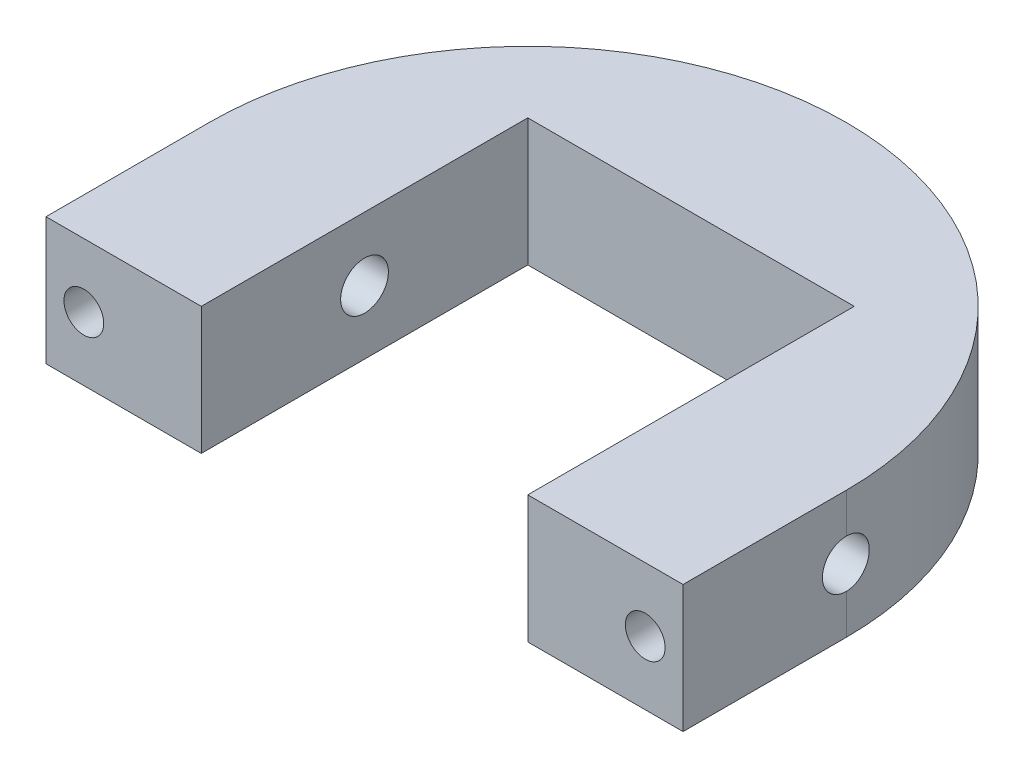
ISO-10303-21;
HEADER;
FILE_DESCRIPTION(('STEP AP214'),'2;1');
FILE_NAME('part.step','',(''),(''),'','','');
FILE_SCHEMA(('AUTOMOTIVE_DESIGN { 1 0 10303 214 1 1 1 1 }'));
ENDSEC;
DATA;
#1=APPLICATION_CONTEXT('core data for automotive mechanical design processes');
#2=APPLICATION_PROTOCOL_DEFINITION('international standard','automotive_design',2000,#1);
#3=PRODUCT_CONTEXT('',#1,'mechanical');
#4=PRODUCT('Part','Part','',(#3));
#5=PRODUCT_RELATED_PRODUCT_CATEGORY('part','',(#4));
#6=PRODUCT_DEFINITION_FORMATION('','',#4);
#7=PRODUCT_DEFINITION_CONTEXT('part definition',#1,'design');
#8=PRODUCT_DEFINITION('design','',#6,#7);
#9=PRODUCT_DEFINITION_SHAPE('','',#8);
#10=(LENGTH_UNIT() NAMED_UNIT(*) SI_UNIT(.MILLI.,.METRE.));
#11=(NAMED_UNIT(*) PLANE_ANGLE_UNIT() SI_UNIT($,.RADIAN.));
#12=(NAMED_UNIT(*) SI_UNIT($,.STERADIAN.) SOLID_ANGLE_UNIT());
#13=UNCERTAINTY_MEASURE_WITH_UNIT(LENGTH_MEASURE(1.E-05),#10,'distance_accuracy_value','');
#14=(GEOMETRIC_REPRESENTATION_CONTEXT(3) GLOBAL_UNCERTAINTY_ASSIGNED_CONTEXT((#13)) GLOBAL_UNIT_ASSIGNED_CONTEXT((#10,
#11,#12)) REPRESENTATION_CONTEXT('',''));
#15=CARTESIAN_POINT('',(0.,0.,0.));
#16=DIRECTION('',(0.,0.,1.));
#17=DIRECTION('',(1.,0.,0.));
#18=AXIS2_PLACEMENT_3D('',#15,#16,#17);
#19=CARTESIAN_POINT('',(35.25,8.,7.87476235655557));
#20=DIRECTION('',(0.,0.,1.));
#21=DIRECTION('',(1.,0.,0.));
#22=AXIS2_PLACEMENT_3D('',#19,#20,#21);
#23=CONICAL_SURFACE('',#22,2.49999999999999,1.02974425867665);
#24=CARTESIAN_POINT('',(35.25,8.,6.37261080898667));
#25=VERTEX_POINT('',#24);
#26=VERTEX_LOOP('',#25);
#27=FACE_BOUND('',#26,.T.);
#28=CARTESIAN_POINT('',(35.25,8.,7.87476235655557));
#29=DIRECTION('',(0.,0.,1.));
#30=DIRECTION('',(1.,0.,0.));
#31=AXIS2_PLACEMENT_3D('',#28,#29,#30);
#32=CIRCLE('',#31,2.49999999999999);
#33=CARTESIAN_POINT('',(37.75,8.,7.87476235655557));
#34=VERTEX_POINT('',#33);
#35=EDGE_CURVE('E213',#34,#34,#32,.T.);
#36=ORIENTED_EDGE('',*,*,#35,.T.);
#37=EDGE_LOOP('',(#36));
#38=FACE_BOUND('',#37,.T.);
#39=ADVANCED_FACE('F35',(#27,#38),#23,.F.);
#40=CARTESIAN_POINT('',(35.25,8.,32.8747623565556));
#41=DIRECTION('',(0.,0.,1.));
#42=DIRECTION('',(1.,0.,0.));
#43=AXIS2_PLACEMENT_3D('',#40,#41,#42);
#44=CYLINDRICAL_SURFACE('',#43,2.49999999999999);
#45=CARTESIAN_POINT('',(35.25,8.,20.5));
#46=DIRECTION('',(0.,0.,-1.));
#47=DIRECTION('',(-1.,0.,0.));
#48=AXIS2_PLACEMENT_3D('',#45,#46,#47);
#49=CIRCLE('',#48,2.49999999999999);
#50=CARTESIAN_POINT('',(32.75,8.,20.5));
#51=VERTEX_POINT('',#50);
#52=EDGE_CURVE('E205',#51,#51,#49,.F.);
#53=ORIENTED_EDGE('',*,*,#52,.T.);
#54=EDGE_LOOP('',(#53));
#55=FACE_BOUND('',#54,.T.);
#56=ORIENTED_EDGE('',*,*,#35,.F.);
#57=EDGE_LOOP('',(#56));
#58=FACE_BOUND('',#57,.T.);
#59=ADVANCED_FACE('F260',(#55,#58),#44,.F.);
#60=CARTESIAN_POINT('',(40.,-15.,20.5));
#61=DIRECTION('',(0.,0.,-1.));
#62=DIRECTION('',(-1.,0.,0.));
#63=AXIS2_PLACEMENT_3D('',#60,#61,#62);
#64=PLANE('',#63);
#65=DIRECTION('',(-1.,0.,0.));
#66=VECTOR('',#65,1.);
#67=CARTESIAN_POINT('',(0.,16.,20.5));
#68=LINE('',#67,#66);
#69=CARTESIAN_POINT('',(40.,16.,20.5));
#70=VERTEX_POINT('',#69);
#71=CARTESIAN_POINT('',(20.5,16.,20.5));
#72=VERTEX_POINT('',#71);
#73=EDGE_CURVE('E208',#70,#72,#68,.T.);
#74=ORIENTED_EDGE('',*,*,#73,.T.);
#75=DIRECTION('',(0.,1.,0.));
#76=VECTOR('',#75,1.);
#77=CARTESIAN_POINT('',(20.5,0.,20.5));
#78=LINE('',#77,#76);
#79=CARTESIAN_POINT('',(20.5,0.,20.5));
#80=VERTEX_POINT('',#79);
#81=EDGE_CURVE('E178',#80,#72,#78,.T.);
#82=ORIENTED_EDGE('',*,*,#81,.F.);
#83=DIRECTION('',(-1.,0.,0.));
#84=VECTOR('',#83,1.);
#85=CARTESIAN_POINT('',(0.,0.,20.5));
#86=LINE('',#85,#84);
#87=CARTESIAN_POINT('',(40.,0.,20.5));
#88=VERTEX_POINT('',#87);
#89=EDGE_CURVE('E60',#88,#80,#86,.T.);
#90=ORIENTED_EDGE('',*,*,#89,.F.);
#91=DIRECTION('',(0.,1.,0.));
#92=VECTOR('',#91,1.);
#93=CARTESIAN_POINT('',(40.,-15.,20.5));
#94=LINE('',#93,#92);
#95=EDGE_CURVE('E136',#88,#70,#94,.T.);
#96=ORIENTED_EDGE('',*,*,#95,.T.);
#97=EDGE_LOOP('',(#74,#82,#90,#96));
#98=FACE_BOUND('',#97,.T.);
#99=ORIENTED_EDGE('',*,*,#52,.F.);
#100=EDGE_LOOP('',(#99));
#101=FACE_BOUND('',#100,.T.);
#102=ADVANCED_FACE('F265',(#98,#101),#64,.F.);
#103=CARTESIAN_POINT('',(0.,16.,0.));
#104=DIRECTION('',(0.,-1.,0.));
#105=DIRECTION('',(0.,0.,-1.));
#106=AXIS2_PLACEMENT_3D('',#103,#104,#105);
#107=CYLINDRICAL_SURFACE('',#106,40.);
#108=DIRECTION('',(0.,1.,0.));
#109=VECTOR('',#108,1.);
#110=CARTESIAN_POINT('',(40.,-86.4913290451708,0.));
#111=LINE('',#110,#109);
#112=CARTESIAN_POINT('',(40.,11.,0.));
#113=VERTEX_POINT('',#112);
#114=CARTESIAN_POINT('',(40.,16.,0.));
#115=VERTEX_POINT('',#114);
#116=EDGE_CURVE('E147',#113,#115,#111,.T.);
#117=ORIENTED_EDGE('',*,*,#116,.F.);
#118=CARTESIAN_POINT('',(40.,11.,0.));
#119=CARTESIAN_POINT('',(40.0000025820989,11.0000082207304,-0.0842519337893709));
#120=CARTESIAN_POINT('',(39.999733864583,10.9964508449652,-0.168499874747025));
#121=CARTESIAN_POINT('',(39.998672903971,10.9822685414989,-0.336390706842955));
#122=CARTESIAN_POINT('',(39.997880691341,10.9716440250893,-0.420033632905374));
#123=CARTESIAN_POINT('',(39.9957926639505,10.9434026174123,-0.586059415483907));
#124=CARTESIAN_POINT('',(39.9944972614647,10.9257914502121,-0.668443246319993));
#125=CARTESIAN_POINT('',(39.9914417526773,10.883721435905,-0.831410088455883));
#126=CARTESIAN_POINT('',(39.989681651006,10.8592626570271,-0.911993117690044));
#127=CARTESIAN_POINT('',(39.9837722599733,10.7758194983056,-1.15025422156428));
#128=CARTESIAN_POINT('',(39.9789928262019,10.7067548303599,-1.30452302918149));
#129=CARTESIAN_POINT('',(39.9682934094469,10.543823834422,-1.59916835807549));
#130=CARTESIAN_POINT('',(39.9623736020872,10.4499613246073,-1.73954701347929));
#131=CARTESIAN_POINT('',(39.9500441386983,10.2398690677085,-2.00284405574504));
#132=CARTESIAN_POINT('',(39.9436336368214,10.1236001486432,-2.12573119915839));
#133=CARTESIAN_POINT('',(39.9310518285172,9.87206977950343,-2.35027392014215));
#134=CARTESIAN_POINT('',(39.9248805586831,9.73680543839624,-2.45192625998527));
#135=CARTESIAN_POINT('',(39.9134669087638,9.45094083231814,-2.63120995149278));
#136=CARTESIAN_POINT('',(39.9082256045901,9.30032311746122,-2.70881355675637));
#137=CARTESIAN_POINT('',(39.899274995184,8.98815933550294,-2.83761304626001));
#138=CARTESIAN_POINT('',(39.8955655740768,8.82661409605658,-2.88881092795233));
#139=CARTESIAN_POINT('',(39.8901052119818,8.49749425797311,-2.96326025824898));
#140=CARTESIAN_POINT('',(39.8883506039989,8.3299315592269,-2.98656403897343));
#141=CARTESIAN_POINT('',(39.8869867691731,7.99326026353682,-3.00472522509086));
#142=CARTESIAN_POINT('',(39.8873775617787,7.82415165259275,-2.99958237260813));
#143=CARTESIAN_POINT('',(39.8902571307251,7.48955598448005,-2.96103864431119));
#144=CARTESIAN_POINT('',(39.8927416305838,7.32406225012986,-2.92769536850408));
#145=CARTESIAN_POINT('',(39.8995219238671,7.0010278694021,-2.83378680992146));
#146=CARTESIAN_POINT('',(39.9038177235755,6.84348725061724,-2.77322143270828));
#147=CARTESIAN_POINT('',(39.9137415865039,6.54064304702218,-2.62652168452174));
#148=CARTESIAN_POINT('',(39.9193710288684,6.39535234238136,-2.54036082120467));
#149=CARTESIAN_POINT('',(39.9313261861455,6.12128065448371,-2.34493899779349));
#150=CARTESIAN_POINT('',(39.9376518800897,5.99249917428258,-2.23567873327706));
#151=CARTESIAN_POINT('',(39.9503050899847,5.75477592452502,-1.99685373321994));
#152=CARTESIAN_POINT('',(39.9566325755469,5.64588129615201,-1.86724207273072));
#153=CARTESIAN_POINT('',(39.9685642796887,5.45135495576657,-1.59150157606447));
#154=CARTESIAN_POINT('',(39.9741682737937,5.36573045461256,-1.44536763984626));
#155=CARTESIAN_POINT('',(39.9840229652691,5.22018178713578,-1.14068220271077));
#156=CARTESIAN_POINT('',(39.9882727401827,5.16027512949421,-0.982122328800783));
#157=CARTESIAN_POINT('',(39.9949278185792,5.06803781366773,-0.657276566091565));
#158=CARTESIAN_POINT('',(39.9973359223906,5.03566528039795,-0.491002816529944));
#159=CARTESIAN_POINT('',(39.9991276565228,5.01165189029522,-0.269659065148874));
#160=CARTESIAN_POINT('',(39.9994546007981,5.00728019678316,-0.215772816987304));
#161=CARTESIAN_POINT('',(39.9998904927226,5.00145821857928,-0.107931774306964));
#162=CARTESIAN_POINT('',(39.9999998025047,5.00000308085858,-0.053977243388215));
#163=CARTESIAN_POINT('',(40.,5.,0.));
#164=B_SPLINE_CURVE_WITH_KNOTS('',3,(#118,#119,#120,#121,#122,#123,#124,#125,#126,#127,#128,
#129,#130,#131,#132,#133,#134,#135,#136,#137,#138,#139,#140,#141,#142,#143,#144,#145,#146,#147,
#148,#149,#150,#151,#152,#153,#154,#155,#156,#157,#158,#159,#160,#161,#162,#163),.UNSPECIFIED.,
.F.,.F.,(4,2,2,2,2,2,2,2,2,2,2,2,2,2,2,2,2,2,2,2,2,2,4),(0.,0.252673135143106,0.505331566571939,
0.757783424494912,1.01023276710415,1.51489486813503,2.01947931048877,2.52495402862034,
3.03050576167094,3.53663862553314,4.04273319752416,4.5478767898478,5.0530249614297,
5.55714384119307,6.06126446983592,6.56590871220456,7.07053776070408,7.57634791529819,
8.08231463016253,8.58862526247538,9.09416449179665,9.25630110974248,9.41816771430228),.UNSPECIFIED.);
#165=CARTESIAN_POINT('',(40.,5.,0.));
#166=VERTEX_POINT('',#165);
#167=EDGE_CURVE('E150',#113,#166,#164,.T.);
#168=ORIENTED_EDGE('',*,*,#167,.T.);
#169=CARTESIAN_POINT('',(40.,0.,0.));
#170=VERTEX_POINT('',#169);
#171=EDGE_CURVE('E143',#170,#166,#111,.T.);
#172=ORIENTED_EDGE('',*,*,#171,.F.);
#173=CARTESIAN_POINT('',(0.,0.,0.));
#174=DIRECTION('',(0.,1.,0.));
#175=DIRECTION('',(0.,0.,1.));
#176=AXIS2_PLACEMENT_3D('',#173,#174,#175);
#177=CIRCLE('',#176,40.);
#178=CARTESIAN_POINT('',(-40.,0.,0.));
#179=VERTEX_POINT('',#178);
#180=EDGE_CURVE('E181',#170,#179,#177,.T.);
#181=ORIENTED_EDGE('',*,*,#180,.T.);
#182=DIRECTION('',(0.,1.,0.));
#183=VECTOR('',#182,1.);
#184=CARTESIAN_POINT('',(-40.,-86.4913290451708,0.));
#185=LINE('',#184,#183);
#186=CARTESIAN_POINT('',(-40.,5.,0.));
#187=VERTEX_POINT('',#186);
#188=EDGE_CURVE('E142',#179,#187,#185,.T.);
#189=ORIENTED_EDGE('',*,*,#188,.T.);
#190=CARTESIAN_POINT('',(-40.,5.,0.));
#191=CARTESIAN_POINT('',(-40.0000025820989,4.99999177926963,-0.0842519337893613));
#192=CARTESIAN_POINT('',(-39.999733864583,5.00354915503478,-0.168499874747016));
#193=CARTESIAN_POINT('',(-39.998672903971,5.01773145850105,-0.336390706842945));
#194=CARTESIAN_POINT('',(-39.997880691341,5.0283559749107,-0.420033632905365));
#195=CARTESIAN_POINT('',(-39.9957926639505,5.05659738258767,-0.586059415483898));
#196=CARTESIAN_POINT('',(-39.9944972614647,5.07420854978791,-0.668443246319984));
#197=CARTESIAN_POINT('',(-39.9914417526773,5.11627856409495,-0.831410088455874));
#198=CARTESIAN_POINT('',(-39.989681651006,5.14073734297288,-0.911993117690035));
#199=CARTESIAN_POINT('',(-39.9837722599733,5.22418050169437,-1.15025422156427));
#200=CARTESIAN_POINT('',(-39.9789928262019,5.29324516964008,-1.30452302918148));
#201=CARTESIAN_POINT('',(-39.9682934094469,5.45617616557795,-1.59916835807549));
#202=CARTESIAN_POINT('',(-39.9623736020872,5.55003867539266,-1.73954701347929));
#203=CARTESIAN_POINT('',(-39.9500441386983,5.76013093229153,-2.00284405574503));
#204=CARTESIAN_POINT('',(-39.9436336368214,5.87639985135679,-2.12573119915838));
#205=CARTESIAN_POINT('',(-39.9310518285172,6.12793022049656,-2.35027392014215));
#206=CARTESIAN_POINT('',(-39.9248805586831,6.26319456160375,-2.45192625998526));
#207=CARTESIAN_POINT('',(-39.9134669087638,6.54905916768186,-2.63120995149278));
#208=CARTESIAN_POINT('',(-39.9082256045901,6.69967688253877,-2.70881355675636));
#209=CARTESIAN_POINT('',(-39.899274995184,7.01184066449705,-2.83761304626));
#210=CARTESIAN_POINT('',(-39.8955655740768,7.17338590394341,-2.88881092795232));
#211=CARTESIAN_POINT('',(-39.8901052119818,7.50250574202688,-2.96326025824898));
#212=CARTESIAN_POINT('',(-39.8883506039989,7.67006844077309,-2.98656403897343));
#213=CARTESIAN_POINT('',(-39.8869867691731,8.00673973646317,-3.00472522509086));
#214=CARTESIAN_POINT('',(-39.8873775617787,8.17584834740724,-2.99958237260813));
#215=CARTESIAN_POINT('',(-39.8902571307251,8.51044401551994,-2.96103864431119));
#216=CARTESIAN_POINT('',(-39.8927416305838,8.67593774987014,-2.92769536850408));
#217=CARTESIAN_POINT('',(-39.8995219238671,8.99897213059789,-2.83378680992146));
#218=CARTESIAN_POINT('',(-39.9038177235755,9.15651274938275,-2.77322143270828));
#219=CARTESIAN_POINT('',(-39.9137415865039,9.45935695297782,-2.62652168452175));
#220=CARTESIAN_POINT('',(-39.9193710288684,9.60464765761863,-2.54036082120467));
#221=CARTESIAN_POINT('',(-39.9313261861455,9.87871934551628,-2.3449389977935));
#222=CARTESIAN_POINT('',(-39.9376518800897,10.0075008257174,-2.23567873327706));
#223=CARTESIAN_POINT('',(-39.9503050899847,10.245224075475,-1.99685373321995));
#224=CARTESIAN_POINT('',(-39.9566325755469,10.354118703848,-1.86724207273072));
#225=CARTESIAN_POINT('',(-39.9685642796887,10.5486450442334,-1.59150157606448));
#226=CARTESIAN_POINT('',(-39.9741682737937,10.6342695453874,-1.44536763984627));
#227=CARTESIAN_POINT('',(-39.9840229652691,10.7798182128642,-1.14068220271078));
#228=CARTESIAN_POINT('',(-39.9882727401826,10.8397248705058,-0.982122328800791));
#229=CARTESIAN_POINT('',(-39.9949278185792,10.9319621863323,-0.657276566091573));
#230=CARTESIAN_POINT('',(-39.9973359223906,10.964334719602,-0.491002816529953));
#231=CARTESIAN_POINT('',(-39.9991276565228,10.9883481097048,-0.26965906514888));
#232=CARTESIAN_POINT('',(-39.9994546007981,10.9927198032168,-0.215772816987307));
#233=CARTESIAN_POINT('',(-39.9998904927226,10.9985417814207,-0.107931774306961));
#234=CARTESIAN_POINT('',(-39.9999998025047,10.9999969191414,-0.0539772433882085));
#235=CARTESIAN_POINT('',(-40.,11.,0.));
#236=B_SPLINE_CURVE_WITH_KNOTS('',3,(#190,#191,#192,#193,#194,#195,#196,#197,#198,#199,#200,
#201,#202,#203,#204,#205,#206,#207,#208,#209,#210,#211,#212,#213,#214,#215,#216,#217,#218,#219,
#220,#221,#222,#223,#224,#225,#226,#227,#228,#229,#230,#231,#232,#233,#234,#235),.UNSPECIFIED.,
.F.,.F.,(4,2,2,2,2,2,2,2,2,2,2,2,2,2,2,2,2,2,2,2,2,2,4),(0.,0.252673135143106,0.505331566571939,
0.757783424494912,1.01023276710415,1.51489486813503,2.01947931048877,2.52495402862034,
3.03050576167094,3.53663862553315,4.04273319752416,4.5478767898478,5.0530249614297,
5.55714384119307,6.06126446983592,6.56590871220456,7.07053776070408,7.57634791529819,
8.08231463016253,8.58862526247538,9.09416449179665,9.25630110974249,9.4181677143023),.UNSPECIFIED.);
#237=CARTESIAN_POINT('',(-40.,11.,0.));
#238=VERTEX_POINT('',#237);
#239=EDGE_CURVE('E223',#187,#238,#236,.T.);
#240=ORIENTED_EDGE('',*,*,#239,.T.);
#241=CARTESIAN_POINT('',(-40.,16.,0.));
#242=VERTEX_POINT('',#241);
#243=EDGE_CURVE('E161',#238,#242,#185,.T.);
#244=ORIENTED_EDGE('',*,*,#243,.T.);
#245=CARTESIAN_POINT('',(0.,16.,0.));
#246=DIRECTION('',(0.,1.,0.));
#247=DIRECTION('',(0.,0.,1.));
#248=AXIS2_PLACEMENT_3D('',#245,#246,#247);
#249=CIRCLE('',#248,40.);
#250=EDGE_CURVE('E45',#115,#242,#249,.T.);
#251=ORIENTED_EDGE('',*,*,#250,.F.);
#252=EDGE_LOOP('',(#117,#168,#172,#181,#189,#240,#244,#251));
#253=FACE_BOUND('',#252,.T.);
#254=ADVANCED_FACE('F37',(#253),#107,.T.);
#255=CARTESIAN_POINT('',(0.,16.,0.));
#256=DIRECTION('',(0.,1.,0.));
#257=DIRECTION('',(0.,0.,1.));
#258=AXIS2_PLACEMENT_3D('',#255,#256,#257);
#259=PLANE('',#258);
#260=ORIENTED_EDGE('',*,*,#73,.F.);
#261=DIRECTION('',(0.,0.,-1.));
#262=VECTOR('',#261,1.);
#263=CARTESIAN_POINT('',(40.,16.,0.));
#264=LINE('',#263,#262);
#265=EDGE_CURVE('E160',#70,#115,#264,.T.);
#266=ORIENTED_EDGE('',*,*,#265,.T.);
#267=ORIENTED_EDGE('',*,*,#250,.T.);
#268=DIRECTION('',(0.,0.,1.));
#269=VECTOR('',#268,1.);
#270=CARTESIAN_POINT('',(-40.,16.,0.));
#271=LINE('',#270,#269);
#272=CARTESIAN_POINT('',(-40.,16.,20.5));
#273=VERTEX_POINT('',#272);
#274=EDGE_CURVE('E158',#242,#273,#271,.T.);
#275=ORIENTED_EDGE('',*,*,#274,.T.);
#276=CARTESIAN_POINT('',(-20.5,16.,20.5));
#277=VERTEX_POINT('',#276);
#278=EDGE_CURVE('E52',#277,#273,#68,.T.);
#279=ORIENTED_EDGE('',*,*,#278,.F.);
#280=DIRECTION('',(0.,0.,1.));
#281=VECTOR('',#280,1.);
#282=CARTESIAN_POINT('',(-20.5,16.,20.5));
#283=LINE('',#282,#281);
#284=CARTESIAN_POINT('',(-20.5,16.,-20.5));
#285=VERTEX_POINT('',#284);
#286=EDGE_CURVE('E167',#285,#277,#283,.T.);
#287=ORIENTED_EDGE('',*,*,#286,.F.);
#288=DIRECTION('',(-1.,0.,0.));
#289=VECTOR('',#288,1.);
#290=CARTESIAN_POINT('',(20.5,16.,-20.5));
#291=LINE('',#290,#289);
#292=CARTESIAN_POINT('',(20.5,16.,-20.5));
#293=VERTEX_POINT('',#292);
#294=EDGE_CURVE('E173',#293,#285,#291,.T.);
#295=ORIENTED_EDGE('',*,*,#294,.F.);
#296=DIRECTION('',(0.,0.,-1.));
#297=VECTOR('',#296,1.);
#298=CARTESIAN_POINT('',(20.5,16.,20.5));
#299=LINE('',#298,#297);
#300=EDGE_CURVE('E171',#72,#293,#299,.T.);
#301=ORIENTED_EDGE('',*,*,#300,.F.);
#302=EDGE_LOOP('',(#260,#266,#267,#275,#279,#287,#295,#301));
#303=FACE_BOUND('',#302,.T.);
#304=ADVANCED_FACE('F253',(#303),#259,.T.);
#305=CARTESIAN_POINT('',(0.,0.,0.));
#306=DIRECTION('',(0.,1.,0.));
#307=DIRECTION('',(0.,0.,1.));
#308=AXIS2_PLACEMENT_3D('',#305,#306,#307);
#309=PLANE('',#308);
#310=DIRECTION('',(0.,0.,1.));
#311=VECTOR('',#310,1.);
#312=CARTESIAN_POINT('',(40.,0.,0.));
#313=LINE('',#312,#311);
#314=EDGE_CURVE('E128',#170,#88,#313,.T.);
#315=ORIENTED_EDGE('',*,*,#314,.T.);
#316=ORIENTED_EDGE('',*,*,#89,.T.);
#317=DIRECTION('',(0.,0.,-1.));
#318=VECTOR('',#317,1.);
#319=CARTESIAN_POINT('',(20.5,0.,20.5));
#320=LINE('',#319,#318);
#321=CARTESIAN_POINT('',(20.5,0.,-20.5));
#322=VERTEX_POINT('',#321);
#323=EDGE_CURVE('E164',#80,#322,#320,.T.);
#324=ORIENTED_EDGE('',*,*,#323,.T.);
#325=DIRECTION('',(-1.,0.,0.));
#326=VECTOR('',#325,1.);
#327=CARTESIAN_POINT('',(20.5,0.,-20.5));
#328=LINE('',#327,#326);
#329=CARTESIAN_POINT('',(-20.5,0.,-20.5));
#330=VERTEX_POINT('',#329);
#331=EDGE_CURVE('E166',#322,#330,#328,.T.);
#332=ORIENTED_EDGE('',*,*,#331,.T.);
#333=DIRECTION('',(0.,0.,1.));
#334=VECTOR('',#333,1.);
#335=CARTESIAN_POINT('',(-20.5,0.,20.5));
#336=LINE('',#335,#334);
#337=CARTESIAN_POINT('',(-20.5,0.,20.5));
#338=VERTEX_POINT('',#337);
#339=EDGE_CURVE('E126',#330,#338,#336,.T.);
#340=ORIENTED_EDGE('',*,*,#339,.T.);
#341=CARTESIAN_POINT('',(-40.,0.,20.5));
#342=VERTEX_POINT('',#341);
#343=EDGE_CURVE('E119',#338,#342,#86,.T.);
#344=ORIENTED_EDGE('',*,*,#343,.T.);
#345=DIRECTION('',(0.,0.,-1.));
#346=VECTOR('',#345,1.);
#347=CARTESIAN_POINT('',(-40.,0.,0.));
#348=LINE('',#347,#346);
#349=EDGE_CURVE('E123',#342,#179,#348,.T.);
#350=ORIENTED_EDGE('',*,*,#349,.T.);
#351=ORIENTED_EDGE('',*,*,#180,.F.);
#352=EDGE_LOOP('',(#315,#316,#324,#332,#340,#344,#350,#351));
#353=FACE_BOUND('',#352,.T.);
#354=ADVANCED_FACE('F121',(#353),#309,.F.);
#355=CARTESIAN_POINT('',(20.5,0.,20.5));
#356=DIRECTION('',(1.,0.,0.));
#357=DIRECTION('',(0.,0.,-1.));
#358=AXIS2_PLACEMENT_3D('',#355,#356,#357);
#359=PLANE('',#358);
#360=CARTESIAN_POINT('',(20.5,8.,0.));
#361=DIRECTION('',(1.,0.,0.));
#362=DIRECTION('',(0.,0.,-1.));
#363=AXIS2_PLACEMENT_3D('',#360,#361,#362);
#364=CIRCLE('',#363,3.);
#365=CARTESIAN_POINT('',(20.5,8.,-3.));
#366=VERTEX_POINT('',#365);
#367=EDGE_CURVE('E221',#366,#366,#364,.T.);
#368=ORIENTED_EDGE('',*,*,#367,.T.);
#369=EDGE_LOOP('',(#368));
#370=FACE_BOUND('',#369,.T.);
#371=DIRECTION('',(0.,1.,0.));
#372=VECTOR('',#371,1.);
#373=CARTESIAN_POINT('',(20.5,0.,-20.5));
#374=LINE('',#373,#372);
#375=EDGE_CURVE('E170',#322,#293,#374,.T.);
#376=ORIENTED_EDGE('',*,*,#375,.F.);
#377=ORIENTED_EDGE('',*,*,#323,.F.);
#378=ORIENTED_EDGE('',*,*,#81,.T.);
#379=ORIENTED_EDGE('',*,*,#300,.T.);
#380=EDGE_LOOP('',(#376,#377,#378,#379));
#381=FACE_BOUND('',#380,.T.);
#382=ADVANCED_FACE('F245',(#370,#381),#359,.F.);
#383=CARTESIAN_POINT('',(-20.5,0.,20.5));
#384=DIRECTION('',(-1.,0.,0.));
#385=DIRECTION('',(0.,0.,1.));
#386=AXIS2_PLACEMENT_3D('',#383,#384,#385);
#387=PLANE('',#386);
#388=CARTESIAN_POINT('',(-20.5,8.,0.));
#389=DIRECTION('',(-1.,0.,0.));
#390=DIRECTION('',(0.,0.,1.));
#391=AXIS2_PLACEMENT_3D('',#388,#389,#390);
#392=CIRCLE('',#391,3.);
#393=CARTESIAN_POINT('',(-20.5,8.,3.));
#394=VERTEX_POINT('',#393);
#395=EDGE_CURVE('E218',#394,#394,#392,.T.);
#396=ORIENTED_EDGE('',*,*,#395,.T.);
#397=EDGE_LOOP('',(#396));
#398=FACE_BOUND('',#397,.T.);
#399=ORIENTED_EDGE('',*,*,#286,.T.);
#400=DIRECTION('',(0.,1.,0.));
#401=VECTOR('',#400,1.);
#402=CARTESIAN_POINT('',(-20.5,0.,20.5));
#403=LINE('',#402,#401);
#404=EDGE_CURVE('E182',#338,#277,#403,.T.);
#405=ORIENTED_EDGE('',*,*,#404,.F.);
#406=ORIENTED_EDGE('',*,*,#339,.F.);
#407=DIRECTION('',(0.,1.,0.));
#408=VECTOR('',#407,1.);
#409=CARTESIAN_POINT('',(-20.5,0.,-20.5));
#410=LINE('',#409,#408);
#411=EDGE_CURVE('E184',#330,#285,#410,.T.);
#412=ORIENTED_EDGE('',*,*,#411,.T.);
#413=EDGE_LOOP('',(#399,#405,#406,#412));
#414=FACE_BOUND('',#413,.T.);
#415=ADVANCED_FACE('F242',(#398,#414),#387,.F.);
#416=CARTESIAN_POINT('',(20.5,0.,-20.5));
#417=DIRECTION('',(0.,0.,-1.));
#418=DIRECTION('',(-1.,0.,0.));
#419=AXIS2_PLACEMENT_3D('',#416,#417,#418);
#420=PLANE('',#419);
#421=ORIENTED_EDGE('',*,*,#294,.T.);
#422=ORIENTED_EDGE('',*,*,#411,.F.);
#423=ORIENTED_EDGE('',*,*,#331,.F.);
#424=ORIENTED_EDGE('',*,*,#375,.T.);
#425=EDGE_LOOP('',(#421,#422,#423,#424));
#426=FACE_BOUND('',#425,.T.);
#427=ADVANCED_FACE('F241',(#426),#420,.F.);
#428=CARTESIAN_POINT('',(-40.,-86.4913290451708,0.));
#429=DIRECTION('',(-1.,0.,0.));
#430=DIRECTION('',(0.,0.,1.));
#431=AXIS2_PLACEMENT_3D('',#428,#429,#430);
#432=PLANE('',#431);
#433=DIRECTION('',(0.,1.,0.));
#434=VECTOR('',#433,1.);
#435=CARTESIAN_POINT('',(-40.,-15.,20.5));
#436=LINE('',#435,#434);
#437=EDGE_CURVE('E130',#342,#273,#436,.T.);
#438=ORIENTED_EDGE('',*,*,#437,.T.);
#439=ORIENTED_EDGE('',*,*,#274,.F.);
#440=ORIENTED_EDGE('',*,*,#243,.F.);
#441=CARTESIAN_POINT('',(-40.,8.,0.));
#442=DIRECTION('',(-1.,0.,0.));
#443=DIRECTION('',(0.,0.,1.));
#444=AXIS2_PLACEMENT_3D('',#441,#442,#443);
#445=CIRCLE('',#444,3.);
#446=EDGE_CURVE('E216',#187,#238,#445,.T.);
#447=ORIENTED_EDGE('',*,*,#446,.F.);
#448=ORIENTED_EDGE('',*,*,#188,.F.);
#449=ORIENTED_EDGE('',*,*,#349,.F.);
#450=EDGE_LOOP('',(#438,#439,#440,#447,#448,#449));
#451=FACE_BOUND('',#450,.T.);
#452=ADVANCED_FACE('F139',(#451),#432,.T.);
#453=CARTESIAN_POINT('',(40.,-86.4913290451708,0.));
#454=DIRECTION('',(1.,0.,0.));
#455=DIRECTION('',(0.,0.,-1.));
#456=AXIS2_PLACEMENT_3D('',#453,#454,#455);
#457=PLANE('',#456);
#458=ORIENTED_EDGE('',*,*,#95,.F.);
#459=ORIENTED_EDGE('',*,*,#314,.F.);
#460=ORIENTED_EDGE('',*,*,#171,.T.);
#461=CARTESIAN_POINT('',(40.,8.,0.));
#462=DIRECTION('',(1.,0.,0.));
#463=DIRECTION('',(0.,0.,-1.));
#464=AXIS2_PLACEMENT_3D('',#461,#462,#463);
#465=CIRCLE('',#464,3.);
#466=EDGE_CURVE('E11',#113,#166,#465,.T.);
#467=ORIENTED_EDGE('',*,*,#466,.F.);
#468=ORIENTED_EDGE('',*,*,#116,.T.);
#469=ORIENTED_EDGE('',*,*,#265,.F.);
#470=EDGE_LOOP('',(#458,#459,#460,#467,#468,#469));
#471=FACE_BOUND('',#470,.T.);
#472=ADVANCED_FACE('F198',(#471),#457,.T.);
#473=CARTESIAN_POINT('',(40.,8.,0.));
#474=DIRECTION('',(-1.,0.,0.));
#475=DIRECTION('',(0.,0.,1.));
#476=AXIS2_PLACEMENT_3D('',#473,#474,#475);
#477=CYLINDRICAL_SURFACE('',#476,3.);
#478=ORIENTED_EDGE('',*,*,#367,.F.);
#479=EDGE_LOOP('',(#478));
#480=FACE_BOUND('',#479,.T.);
#481=ORIENTED_EDGE('',*,*,#466,.T.);
#482=ORIENTED_EDGE('',*,*,#167,.F.);
#483=EDGE_LOOP('',(#481,#482));
#484=FACE_BOUND('',#483,.T.);
#485=ADVANCED_FACE('F228',(#480,#484),#477,.F.);
#486=ORIENTED_EDGE('',*,*,#395,.F.);
#487=EDGE_LOOP('',(#486));
#488=FACE_BOUND('',#487,.T.);
#489=ORIENTED_EDGE('',*,*,#446,.T.);
#490=ORIENTED_EDGE('',*,*,#239,.F.);
#491=EDGE_LOOP('',(#489,#490));
#492=FACE_BOUND('',#491,.T.);
#493=ADVANCED_FACE('F233',(#488,#492),#477,.F.);
#494=ORIENTED_EDGE('',*,*,#278,.T.);
#495=ORIENTED_EDGE('',*,*,#437,.F.);
#496=ORIENTED_EDGE('',*,*,#343,.F.);
#497=ORIENTED_EDGE('',*,*,#404,.T.);
#498=EDGE_LOOP('',(#494,#495,#496,#497));
#499=FACE_BOUND('',#498,.T.);
#500=CARTESIAN_POINT('',(-35.25,8.,20.5));
#501=DIRECTION('',(0.,0.,-1.));
#502=DIRECTION('',(-1.,0.,0.));
#503=AXIS2_PLACEMENT_3D('',#500,#501,#502);
#504=CIRCLE('',#503,2.49999999999999);
#505=CARTESIAN_POINT('',(-37.75,8.,20.5));
#506=VERTEX_POINT('',#505);
#507=EDGE_CURVE('E40',#506,#506,#504,.F.);
#508=ORIENTED_EDGE('',*,*,#507,.F.);
#509=EDGE_LOOP('',(#508));
#510=FACE_BOUND('',#509,.T.);
#511=ADVANCED_FACE('F131',(#499,#510),#64,.F.);
#512=CARTESIAN_POINT('',(-35.25,8.,7.87476235655557));
#513=DIRECTION('',(0.,0.,1.));
#514=DIRECTION('',(1.,0.,0.));
#515=AXIS2_PLACEMENT_3D('',#512,#513,#514);
#516=CONICAL_SURFACE('',#515,2.49999999999999,1.02974425867665);
#517=CARTESIAN_POINT('',(-35.25,8.,6.37261080898667));
#518=VERTEX_POINT('',#517);
#519=VERTEX_LOOP('',#518);
#520=FACE_BOUND('',#519,.T.);
#521=CARTESIAN_POINT('',(-35.25,8.,7.87476235655557));
#522=DIRECTION('',(0.,0.,1.));
#523=DIRECTION('',(1.,0.,0.));
#524=AXIS2_PLACEMENT_3D('',#521,#522,#523);
#525=CIRCLE('',#524,2.49999999999999);
#526=CARTESIAN_POINT('',(-32.75,8.,7.87476235655557));
#527=VERTEX_POINT('',#526);
#528=EDGE_CURVE('E210',#527,#527,#525,.T.);
#529=ORIENTED_EDGE('',*,*,#528,.T.);
#530=EDGE_LOOP('',(#529));
#531=FACE_BOUND('',#530,.T.);
#532=ADVANCED_FACE('F275',(#520,#531),#516,.F.);
#533=CARTESIAN_POINT('',(-35.25,8.,32.8747623565556));
#534=DIRECTION('',(0.,0.,1.));
#535=DIRECTION('',(1.,0.,0.));
#536=AXIS2_PLACEMENT_3D('',#533,#534,#535);
#537=CYLINDRICAL_SURFACE('',#536,2.49999999999999);
#538=ORIENTED_EDGE('',*,*,#507,.T.);
#539=EDGE_LOOP('',(#538));
#540=FACE_BOUND('',#539,.T.);
#541=ORIENTED_EDGE('',*,*,#528,.F.);
#542=EDGE_LOOP('',(#541));
#543=FACE_BOUND('',#542,.T.);
#544=ADVANCED_FACE('F278',(#540,#543),#537,.F.);
#545=CLOSED_SHELL('',(#39,#59,#102,#254,#304,#354,#382,#415,#427,#452,#472,#485,#493,#511,#532,#544));
#546=MANIFOLD_SOLID_BREP('B2',#545);
#547=ADVANCED_BREP_SHAPE_REPRESENTATION('',(#18,#546),#14);
#548=SHAPE_DEFINITION_REPRESENTATION(#9,#547);
ENDSEC;
END-ISO-10303-21;
